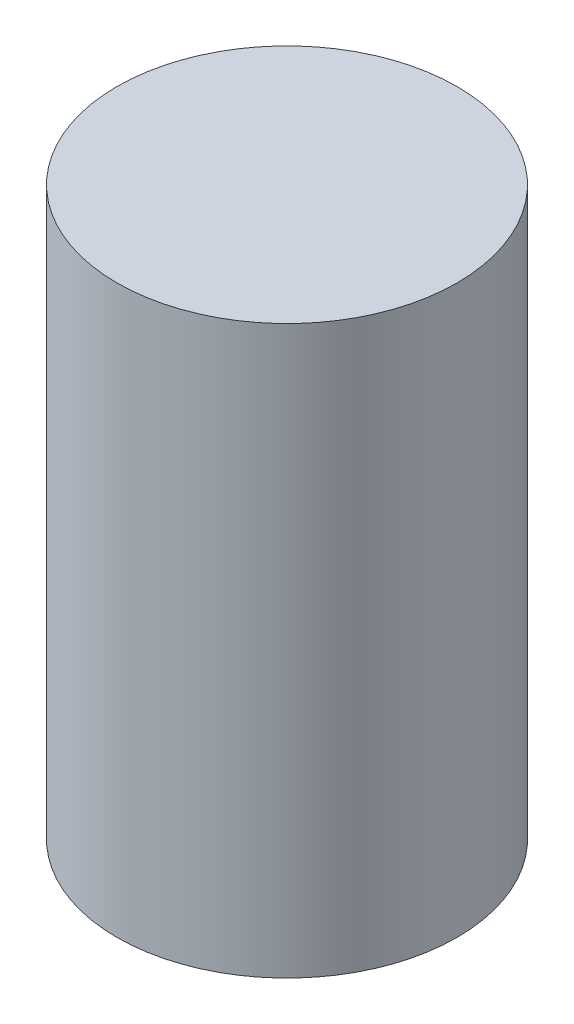
ISO-10303-21;
HEADER;
FILE_DESCRIPTION(('STEP AP214'),'2;1');
FILE_NAME('part.step','',(''),(''),'','','');
FILE_SCHEMA(('AUTOMOTIVE_DESIGN { 1 0 10303 214 1 1 1 1 }'));
ENDSEC;
DATA;
#1=APPLICATION_CONTEXT('core data for automotive mechanical design processes');
#2=APPLICATION_PROTOCOL_DEFINITION('international standard','automotive_design',2000,#1);
#3=PRODUCT_CONTEXT('',#1,'mechanical');
#4=PRODUCT('Part','Part','',(#3));
#5=PRODUCT_RELATED_PRODUCT_CATEGORY('part','',(#4));
#6=PRODUCT_DEFINITION_FORMATION('','',#4);
#7=PRODUCT_DEFINITION_CONTEXT('part definition',#1,'design');
#8=PRODUCT_DEFINITION('design','',#6,#7);
#9=PRODUCT_DEFINITION_SHAPE('','',#8);
#10=(LENGTH_UNIT() NAMED_UNIT(*) SI_UNIT(.MILLI.,.METRE.));
#11=(NAMED_UNIT(*) PLANE_ANGLE_UNIT() SI_UNIT($,.RADIAN.));
#12=(NAMED_UNIT(*) SI_UNIT($,.STERADIAN.) SOLID_ANGLE_UNIT());
#13=UNCERTAINTY_MEASURE_WITH_UNIT(LENGTH_MEASURE(1.E-05),#10,'distance_accuracy_value','');
#14=(GEOMETRIC_REPRESENTATION_CONTEXT(3) GLOBAL_UNCERTAINTY_ASSIGNED_CONTEXT((#13)) GLOBAL_UNIT_ASSIGNED_CONTEXT((#10,
#11,#12)) REPRESENTATION_CONTEXT('',''));
#15=CARTESIAN_POINT('',(0.,0.,0.));
#16=DIRECTION('',(0.,0.,1.));
#17=DIRECTION('',(1.,0.,0.));
#18=AXIS2_PLACEMENT_3D('',#15,#16,#17);
#19=CARTESIAN_POINT('',(820.,1880.,-200.));
#20=DIRECTION('',(0.,-1.,0.));
#21=DIRECTION('',(0.,0.,-1.));
#22=AXIS2_PLACEMENT_3D('',#19,#20,#21);
#23=CYLINDRICAL_SURFACE('',#22,60.0000000000001);
#24=CARTESIAN_POINT('',(820.,1880.,-200.));
#25=DIRECTION('',(0.,1.,0.));
#26=DIRECTION('',(0.,0.,1.));
#27=AXIS2_PLACEMENT_3D('',#24,#25,#26);
#28=CIRCLE('',#27,60.0000000000001);
#29=CARTESIAN_POINT('',(820.,1880.,-140.));
#30=VERTEX_POINT('',#29);
#31=EDGE_CURVE('E10',#30,#30,#28,.T.);
#32=ORIENTED_EDGE('',*,*,#31,.F.);
#33=EDGE_LOOP('',(#32));
#34=FACE_BOUND('',#33,.T.);
#35=CARTESIAN_POINT('',(820.,1680.,-200.));
#36=DIRECTION('',(0.,1.,0.));
#37=DIRECTION('',(0.,0.,1.));
#38=AXIS2_PLACEMENT_3D('',#35,#36,#37);
#39=CIRCLE('',#38,60.0000000000001);
#40=CARTESIAN_POINT('',(820.,1680.,-140.));
#41=VERTEX_POINT('',#40);
#42=EDGE_CURVE('E40',#41,#41,#39,.T.);
#43=ORIENTED_EDGE('',*,*,#42,.T.);
#44=EDGE_LOOP('',(#43));
#45=FACE_BOUND('',#44,.T.);
#46=ADVANCED_FACE('F37',(#34,#45),#23,.T.);
#47=CARTESIAN_POINT('',(820.,1880.,-200.));
#48=DIRECTION('',(0.,1.,0.));
#49=DIRECTION('',(0.,0.,1.));
#50=AXIS2_PLACEMENT_3D('',#47,#48,#49);
#51=PLANE('',#50);
#52=ORIENTED_EDGE('',*,*,#31,.T.);
#53=EDGE_LOOP('',(#52));
#54=FACE_BOUND('',#53,.T.);
#55=ADVANCED_FACE('F52',(#54),#51,.T.);
#56=CARTESIAN_POINT('',(820.,1680.,-200.));
#57=DIRECTION('',(0.,1.,0.));
#58=DIRECTION('',(0.,0.,1.));
#59=AXIS2_PLACEMENT_3D('',#56,#57,#58);
#60=PLANE('',#59);
#61=ORIENTED_EDGE('',*,*,#42,.F.);
#62=EDGE_LOOP('',(#61));
#63=FACE_BOUND('',#62,.T.);
#64=ADVANCED_FACE('F50',(#63),#60,.F.);
#65=CLOSED_SHELL('',(#46,#55,#64));
#66=MANIFOLD_SOLID_BREP('B2',#65);
#67=ADVANCED_BREP_SHAPE_REPRESENTATION('',(#18,#66),#14);
#68=SHAPE_DEFINITION_REPRESENTATION(#9,#67);
ENDSEC;
END-ISO-10303-21;
